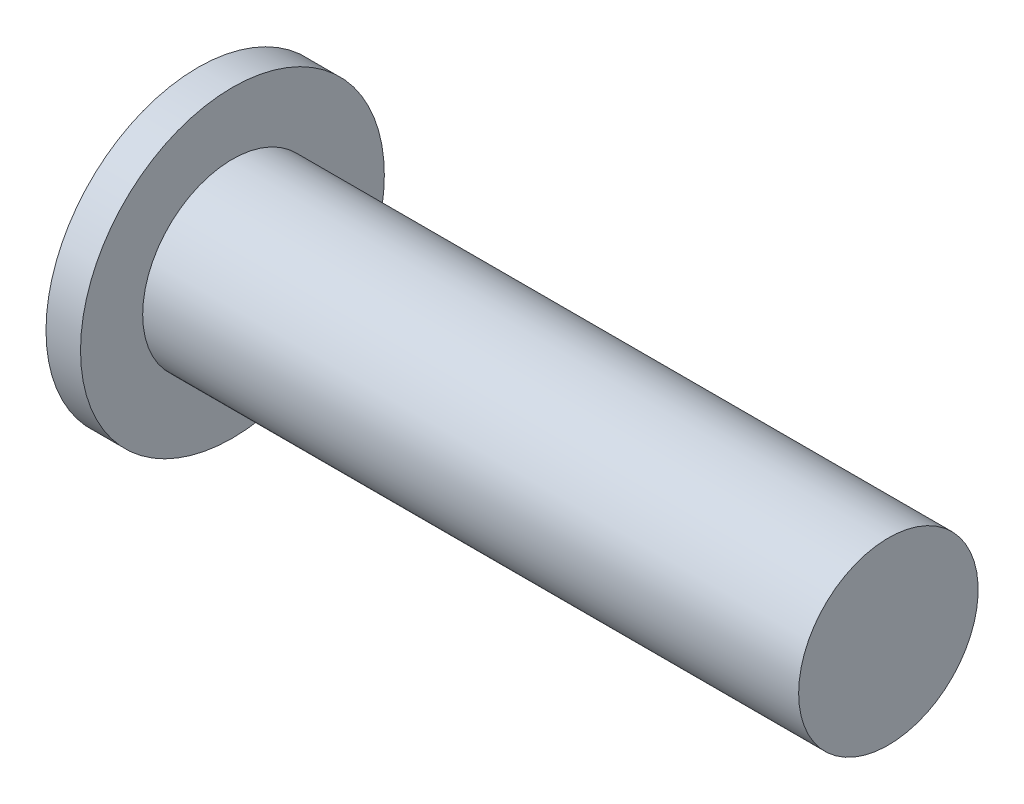
ISO-10303-21;
HEADER;
FILE_DESCRIPTION(('STEP AP214'),'2;1');
FILE_NAME('part.step','',(''),(''),'','','');
FILE_SCHEMA(('AUTOMOTIVE_DESIGN { 1 0 10303 214 1 1 1 1 }'));
ENDSEC;
DATA;
#1=APPLICATION_CONTEXT('core data for automotive mechanical design processes');
#2=APPLICATION_PROTOCOL_DEFINITION('international standard','automotive_design',2000,#1);
#3=PRODUCT_CONTEXT('',#1,'mechanical');
#4=PRODUCT('Part','Part','',(#3));
#5=PRODUCT_RELATED_PRODUCT_CATEGORY('part','',(#4));
#6=PRODUCT_DEFINITION_FORMATION('','',#4);
#7=PRODUCT_DEFINITION_CONTEXT('part definition',#1,'design');
#8=PRODUCT_DEFINITION('design','',#6,#7);
#9=PRODUCT_DEFINITION_SHAPE('','',#8);
#10=(LENGTH_UNIT() NAMED_UNIT(*) SI_UNIT(.MILLI.,.METRE.));
#11=(NAMED_UNIT(*) PLANE_ANGLE_UNIT() SI_UNIT($,.RADIAN.));
#12=(NAMED_UNIT(*) SI_UNIT($,.STERADIAN.) SOLID_ANGLE_UNIT());
#13=UNCERTAINTY_MEASURE_WITH_UNIT(LENGTH_MEASURE(1.E-05),#10,'distance_accuracy_value','');
#14=(GEOMETRIC_REPRESENTATION_CONTEXT(3) GLOBAL_UNCERTAINTY_ASSIGNED_CONTEXT((#13)) GLOBAL_UNIT_ASSIGNED_CONTEXT((#10,
#11,#12)) REPRESENTATION_CONTEXT('',''));
#15=CARTESIAN_POINT('',(0.,0.,0.));
#16=DIRECTION('',(0.,0.,1.));
#17=DIRECTION('',(1.,0.,0.));
#18=AXIS2_PLACEMENT_3D('',#15,#16,#17);
#19=CARTESIAN_POINT('',(90.,0.,0.));
#20=DIRECTION('',(-1.,0.,0.));
#21=DIRECTION('',(0.,0.,1.));
#22=AXIS2_PLACEMENT_3D('',#19,#20,#21);
#23=CYLINDRICAL_SURFACE('',#22,11.);
#24=CARTESIAN_POINT('',(90.,0.,0.));
#25=DIRECTION('',(1.,0.,0.));
#26=DIRECTION('',(0.,0.,-1.));
#27=AXIS2_PLACEMENT_3D('',#24,#25,#26);
#28=CIRCLE('',#27,11.);
#29=CARTESIAN_POINT('',(90.,0.,11.));
#30=VERTEX_POINT('',#29);
#31=EDGE_CURVE('E10',#30,#30,#28,.T.);
#32=CARTESIAN_POINT('',(-5.,0.,0.));
#33=DIRECTION('',(-1.,0.,0.));
#34=DIRECTION('',(0.,0.,1.));
#35=AXIS2_PLACEMENT_3D('',#32,#33,#34);
#36=CIRCLE('',#35,11.);
#37=CARTESIAN_POINT('',(-4.99999999999999,0.,11.));
#38=VERTEX_POINT('',#37);
#39=EDGE_CURVE('E62',#38,#38,#36,.T.);
#40=CARTESIAN_POINT('',(90.,0.,11.));
#41=CARTESIAN_POINT('',(89.0104166666666,0.,11.));
#42=CARTESIAN_POINT('',(88.0208333333333,0.,11.));
#43=CARTESIAN_POINT('',(86.0416666666667,0.,11.));
#44=CARTESIAN_POINT('',(85.0520833333333,0.,11.));
#45=CARTESIAN_POINT('',(83.0729166666666,0.,11.));
#46=CARTESIAN_POINT('',(82.0833333333333,0.,11.));
#47=CARTESIAN_POINT('',(80.1041666666667,0.,11.));
#48=CARTESIAN_POINT('',(79.1145833333333,0.,11.));
#49=CARTESIAN_POINT('',(77.1354166666667,0.,11.));
#50=CARTESIAN_POINT('',(76.1458333333333,0.,11.));
#51=CARTESIAN_POINT('',(74.1666666666667,0.,11.));
#52=CARTESIAN_POINT('',(73.1770833333333,0.,11.));
#53=CARTESIAN_POINT('',(71.1979166666667,0.,11.));
#54=CARTESIAN_POINT('',(70.2083333333333,0.,11.));
#55=CARTESIAN_POINT('',(68.2291666666667,0.,11.));
#56=CARTESIAN_POINT('',(67.2395833333333,0.,11.));
#57=CARTESIAN_POINT('',(65.2604166666667,0.,11.));
#58=CARTESIAN_POINT('',(64.2708333333333,0.,11.));
#59=CARTESIAN_POINT('',(62.2916666666667,0.,11.));
#60=CARTESIAN_POINT('',(61.3020833333333,0.,11.));
#61=CARTESIAN_POINT('',(59.3229166666667,0.,11.));
#62=CARTESIAN_POINT('',(58.3333333333333,0.,11.));
#63=CARTESIAN_POINT('',(56.3541666666667,0.,11.));
#64=CARTESIAN_POINT('',(55.3645833333333,0.,11.));
#65=CARTESIAN_POINT('',(53.3854166666667,0.,11.));
#66=CARTESIAN_POINT('',(52.3958333333333,0.,11.));
#67=CARTESIAN_POINT('',(50.4166666666667,0.,11.));
#68=CARTESIAN_POINT('',(49.4270833333333,0.,11.));
#69=CARTESIAN_POINT('',(47.4479166666667,0.,11.));
#70=CARTESIAN_POINT('',(46.4583333333333,0.,11.));
#71=CARTESIAN_POINT('',(44.4791666666667,0.,11.));
#72=CARTESIAN_POINT('',(43.4895833333333,0.,11.));
#73=CARTESIAN_POINT('',(41.5104166666667,0.,11.));
#74=CARTESIAN_POINT('',(40.5208333333333,0.,11.));
#75=CARTESIAN_POINT('',(38.5416666666667,0.,11.));
#76=CARTESIAN_POINT('',(37.5520833333333,0.,11.));
#77=CARTESIAN_POINT('',(35.5729166666667,0.,11.));
#78=CARTESIAN_POINT('',(34.5833333333333,0.,11.));
#79=CARTESIAN_POINT('',(32.6041666666667,0.,11.));
#80=CARTESIAN_POINT('',(31.6145833333333,0.,11.));
#81=CARTESIAN_POINT('',(29.6354166666667,0.,11.));
#82=CARTESIAN_POINT('',(28.6458333333333,0.,11.));
#83=CARTESIAN_POINT('',(26.6666666666667,0.,11.));
#84=CARTESIAN_POINT('',(25.6770833333333,0.,11.));
#85=CARTESIAN_POINT('',(23.6979166666667,0.,11.));
#86=CARTESIAN_POINT('',(22.7083333333333,0.,11.));
#87=CARTESIAN_POINT('',(20.7291666666667,0.,11.));
#88=CARTESIAN_POINT('',(19.7395833333333,0.,11.));
#89=CARTESIAN_POINT('',(17.7604166666667,0.,11.));
#90=CARTESIAN_POINT('',(16.7708333333333,0.,11.));
#91=CARTESIAN_POINT('',(14.7916666666667,0.,11.));
#92=CARTESIAN_POINT('',(13.8020833333333,0.,11.));
#93=CARTESIAN_POINT('',(11.8229166666667,0.,11.));
#94=CARTESIAN_POINT('',(10.8333333333333,0.,11.));
#95=CARTESIAN_POINT('',(8.85416666666668,0.,11.));
#96=CARTESIAN_POINT('',(7.86458333333334,0.,11.));
#97=CARTESIAN_POINT('',(5.88541666666667,0.,11.));
#98=CARTESIAN_POINT('',(4.89583333333334,0.,11.));
#99=CARTESIAN_POINT('',(2.91666666666668,0.,11.));
#100=CARTESIAN_POINT('',(1.92708333333334,0.,11.));
#101=CARTESIAN_POINT('',(-0.0520833333333228,0.,11.));
#102=CARTESIAN_POINT('',(-1.04166666666665,0.,11.));
#103=CARTESIAN_POINT('',(-3.02083333333332,0.,11.));
#104=CARTESIAN_POINT('',(-4.01041666666666,0.,11.));
#105=CARTESIAN_POINT('',(-4.99999999999999,0.,11.));
#106=B_SPLINE_CURVE_WITH_KNOTS('',3,(#40,#41,#42,#43,#44,#45,#46,#47,#48,#49,#50,#51,#52,#53,
#54,#55,#56,#57,#58,#59,#60,#61,#62,#63,#64,#65,#66,#67,#68,#69,#70,#71,#72,#73,#74,#75,#76,#77,
#78,#79,#80,#81,#82,#83,#84,#85,#86,#87,#88,#89,#90,#91,#92,#93,#94,#95,#96,#97,#98,#99,#100,
#101,#102,#103,#104,#105),.UNSPECIFIED.,.F.,.F.,(4,2,2,2,2,2,2,2,2,2,2,2,2,2,2,2,2,2,2,2,2,2,2,
2,2,2,2,2,2,2,2,2,4),(0.,2.96874999999999,5.9375,8.90624999999999,11.875,14.84375,17.8125,
20.78125,23.75,26.71875,29.6875,32.65625,35.625,38.59375,41.5625,44.53125,47.5,50.46875,53.4375,
56.40625,59.375,62.34375,65.3125,68.28125,71.25,74.21875,77.1875,80.15625,83.125,86.09375,
89.0625,92.03125,95.),.UNSPECIFIED.);
#107=EDGE_CURVE('BSEAM41',#30,#38,#106,.T.);
#108=ORIENTED_EDGE('',*,*,#31,.T.);
#109=ORIENTED_EDGE('',*,*,#39,.T.);
#110=ORIENTED_EDGE('',*,*,#107,.T.);
#111=ORIENTED_EDGE('',*,*,#107,.F.);
#112=EDGE_LOOP('',(#108,#110,#109,#111));
#113=FACE_BOUND('',#112,.T.);
#114=ADVANCED_FACE('F41',(#113),#23,.F.);
#115=CARTESIAN_POINT('',(90.,0.,0.));
#116=DIRECTION('',(1.,0.,0.));
#117=DIRECTION('',(0.,0.,-1.));
#118=AXIS2_PLACEMENT_3D('',#115,#116,#117);
#119=PLANE('',#118);
#120=ORIENTED_EDGE('',*,*,#31,.F.);
#121=EDGE_LOOP('',(#120));
#122=FACE_BOUND('',#121,.T.);
#123=ADVANCED_FACE('F74',(#122),#119,.F.);
#124=CARTESIAN_POINT('',(-5.,0.,0.));
#125=DIRECTION('',(-1.,0.,0.));
#126=DIRECTION('',(0.,0.,1.));
#127=AXIS2_PLACEMENT_3D('',#124,#125,#126);
#128=PLANE('',#127);
#129=CARTESIAN_POINT('',(-5.,0.,0.));
#130=DIRECTION('',(-1.,0.,0.));
#131=DIRECTION('',(0.,0.,1.));
#132=AXIS2_PLACEMENT_3D('',#129,#130,#131);
#133=CIRCLE('',#132,22.);
#134=CARTESIAN_POINT('',(-5.,0.,22.));
#135=VERTEX_POINT('',#134);
#136=EDGE_CURVE('E61',#135,#135,#133,.T.);
#137=ORIENTED_EDGE('',*,*,#136,.T.);
#138=EDGE_LOOP('',(#137));
#139=FACE_BOUND('',#138,.T.);
#140=ORIENTED_EDGE('',*,*,#39,.F.);
#141=EDGE_LOOP('',(#140));
#142=FACE_BOUND('',#141,.T.);
#143=ADVANCED_FACE('F71',(#139,#142),#128,.T.);
#144=CARTESIAN_POINT('',(0.,0.,0.));
#145=DIRECTION('',(-1.,0.,0.));
#146=DIRECTION('',(0.,0.,1.));
#147=AXIS2_PLACEMENT_3D('',#144,#145,#146);
#148=PLANE('',#147);
#149=CARTESIAN_POINT('',(0.,0.,0.));
#150=DIRECTION('',(1.,0.,0.));
#151=DIRECTION('',(0.,0.,-1.));
#152=AXIS2_PLACEMENT_3D('',#149,#150,#151);
#153=CIRCLE('',#152,13.);
#154=CARTESIAN_POINT('',(0.,0.,13.));
#155=VERTEX_POINT('',#154);
#156=EDGE_CURVE('E45',#155,#155,#153,.T.);
#157=ORIENTED_EDGE('',*,*,#156,.F.);
#158=EDGE_LOOP('',(#157));
#159=FACE_BOUND('',#158,.T.);
#160=CARTESIAN_POINT('',(0.,0.,0.));
#161=DIRECTION('',(-1.,0.,0.));
#162=DIRECTION('',(0.,0.,1.));
#163=AXIS2_PLACEMENT_3D('',#160,#161,#162);
#164=CIRCLE('',#163,22.);
#165=CARTESIAN_POINT('',(0.,0.,22.));
#166=VERTEX_POINT('',#165);
#167=EDGE_CURVE('E57',#166,#166,#164,.T.);
#168=ORIENTED_EDGE('',*,*,#167,.F.);
#169=EDGE_LOOP('',(#168));
#170=FACE_BOUND('',#169,.T.);
#171=ADVANCED_FACE('F73',(#159,#170),#148,.F.);
#172=CARTESIAN_POINT('',(-5.,0.,0.));
#173=DIRECTION('',(1.,0.,0.));
#174=DIRECTION('',(0.,0.,-1.));
#175=AXIS2_PLACEMENT_3D('',#172,#173,#174);
#176=CYLINDRICAL_SURFACE('',#175,22.);
#177=ORIENTED_EDGE('',*,*,#136,.F.);
#178=EDGE_LOOP('',(#177));
#179=FACE_BOUND('',#178,.T.);
#180=ORIENTED_EDGE('',*,*,#167,.T.);
#181=EDGE_LOOP('',(#180));
#182=FACE_BOUND('',#181,.T.);
#183=ADVANCED_FACE('F81',(#179,#182),#176,.T.);
#184=CARTESIAN_POINT('',(95.,0.,0.));
#185=DIRECTION('',(1.,0.,0.));
#186=DIRECTION('',(0.,0.,-1.));
#187=AXIS2_PLACEMENT_3D('',#184,#185,#186);
#188=PLANE('',#187);
#189=CARTESIAN_POINT('',(95.,0.,0.));
#190=DIRECTION('',(1.,0.,0.));
#191=DIRECTION('',(0.,0.,-1.));
#192=AXIS2_PLACEMENT_3D('',#189,#190,#191);
#193=CIRCLE('',#192,13.);
#194=CARTESIAN_POINT('',(95.,0.,13.));
#195=VERTEX_POINT('',#194);
#196=EDGE_CURVE('E50',#195,#195,#193,.T.);
#197=ORIENTED_EDGE('',*,*,#196,.T.);
#198=EDGE_LOOP('',(#197));
#199=FACE_BOUND('',#198,.T.);
#200=ADVANCED_FACE('F90',(#199),#188,.T.);
#201=CARTESIAN_POINT('',(90.,0.,0.));
#202=DIRECTION('',(-1.,0.,0.));
#203=DIRECTION('',(0.,0.,1.));
#204=AXIS2_PLACEMENT_3D('',#201,#202,#203);
#205=CYLINDRICAL_SURFACE('',#204,13.);
#206=CARTESIAN_POINT('',(0.,0.,13.));
#207=CARTESIAN_POINT('',(0.98958333333332,0.,13.));
#208=CARTESIAN_POINT('',(1.97916666666666,0.,13.));
#209=CARTESIAN_POINT('',(3.95833333333332,0.,13.));
#210=CARTESIAN_POINT('',(4.94791666666665,0.,13.));
#211=CARTESIAN_POINT('',(6.92708333333332,0.,13.));
#212=CARTESIAN_POINT('',(7.91666666666666,0.,13.));
#213=CARTESIAN_POINT('',(9.89583333333332,0.,13.));
#214=CARTESIAN_POINT('',(10.8854166666667,0.,13.));
#215=CARTESIAN_POINT('',(12.8645833333333,0.,13.));
#216=CARTESIAN_POINT('',(13.8541666666667,0.,13.));
#217=CARTESIAN_POINT('',(15.8333333333333,0.,13.));
#218=CARTESIAN_POINT('',(16.8229166666667,0.,13.));
#219=CARTESIAN_POINT('',(18.8020833333333,0.,13.));
#220=CARTESIAN_POINT('',(19.7916666666667,0.,13.));
#221=CARTESIAN_POINT('',(21.7708333333333,0.,13.));
#222=CARTESIAN_POINT('',(22.7604166666667,0.,13.));
#223=CARTESIAN_POINT('',(24.7395833333333,0.,13.));
#224=CARTESIAN_POINT('',(25.7291666666667,0.,13.));
#225=CARTESIAN_POINT('',(27.7083333333333,0.,13.));
#226=CARTESIAN_POINT('',(28.6979166666667,0.,13.));
#227=CARTESIAN_POINT('',(30.6770833333333,0.,13.));
#228=CARTESIAN_POINT('',(31.6666666666667,0.,13.));
#229=CARTESIAN_POINT('',(33.6458333333333,0.,13.));
#230=CARTESIAN_POINT('',(34.6354166666667,0.,13.));
#231=CARTESIAN_POINT('',(36.6145833333333,0.,13.));
#232=CARTESIAN_POINT('',(37.6041666666667,0.,13.));
#233=CARTESIAN_POINT('',(39.5833333333333,0.,13.));
#234=CARTESIAN_POINT('',(40.5729166666667,0.,13.));
#235=CARTESIAN_POINT('',(42.5520833333333,0.,13.));
#236=CARTESIAN_POINT('',(43.5416666666667,0.,13.));
#237=CARTESIAN_POINT('',(45.5208333333333,0.,13.));
#238=CARTESIAN_POINT('',(46.5104166666667,0.,13.));
#239=CARTESIAN_POINT('',(48.4895833333333,0.,13.));
#240=CARTESIAN_POINT('',(49.4791666666667,0.,13.));
#241=CARTESIAN_POINT('',(51.4583333333333,0.,13.));
#242=CARTESIAN_POINT('',(52.4479166666667,0.,13.));
#243=CARTESIAN_POINT('',(54.4270833333333,0.,13.));
#244=CARTESIAN_POINT('',(55.4166666666667,0.,13.));
#245=CARTESIAN_POINT('',(57.3958333333333,0.,13.));
#246=CARTESIAN_POINT('',(58.3854166666667,0.,13.));
#247=CARTESIAN_POINT('',(60.3645833333333,0.,13.));
#248=CARTESIAN_POINT('',(61.3541666666667,0.,13.));
#249=CARTESIAN_POINT('',(63.3333333333333,0.,13.));
#250=CARTESIAN_POINT('',(64.3229166666667,0.,13.));
#251=CARTESIAN_POINT('',(66.3020833333333,0.,13.));
#252=CARTESIAN_POINT('',(67.2916666666667,0.,13.));
#253=CARTESIAN_POINT('',(69.2708333333333,0.,13.));
#254=CARTESIAN_POINT('',(70.2604166666667,0.,13.));
#255=CARTESIAN_POINT('',(72.2395833333333,0.,13.));
#256=CARTESIAN_POINT('',(73.2291666666667,0.,13.));
#257=CARTESIAN_POINT('',(75.2083333333333,0.,13.));
#258=CARTESIAN_POINT('',(76.1979166666667,0.,13.));
#259=CARTESIAN_POINT('',(78.1770833333333,0.,13.));
#260=CARTESIAN_POINT('',(79.1666666666667,0.,13.));
#261=CARTESIAN_POINT('',(81.1458333333333,0.,13.));
#262=CARTESIAN_POINT('',(82.1354166666667,0.,13.));
#263=CARTESIAN_POINT('',(84.1145833333333,0.,13.));
#264=CARTESIAN_POINT('',(85.1041666666667,0.,13.));
#265=CARTESIAN_POINT('',(87.0833333333333,0.,13.));
#266=CARTESIAN_POINT('',(88.0729166666667,0.,13.));
#267=CARTESIAN_POINT('',(90.0520833333333,0.,13.));
#268=CARTESIAN_POINT('',(91.0416666666667,0.,13.));
#269=CARTESIAN_POINT('',(93.0208333333333,0.,13.));
#270=CARTESIAN_POINT('',(94.0104166666667,0.,13.));
#271=CARTESIAN_POINT('',(95.,0.,13.));
#272=B_SPLINE_CURVE_WITH_KNOTS('',3,(#206,#207,#208,#209,#210,#211,#212,#213,#214,#215,#216,
#217,#218,#219,#220,#221,#222,#223,#224,#225,#226,#227,#228,#229,#230,#231,#232,#233,#234,#235,
#236,#237,#238,#239,#240,#241,#242,#243,#244,#245,#246,#247,#248,#249,#250,#251,#252,#253,#254,
#255,#256,#257,#258,#259,#260,#261,#262,#263,#264,#265,#266,#267,#268,#269,#270,#271),
.UNSPECIFIED.,.F.,.F.,(4,2,2,2,2,2,2,2,2,2,2,2,2,2,2,2,2,2,2,2,2,2,2,2,2,2,2,2,2,2,2,2,4),(0.,
2.96875000000001,5.9375,8.90625,11.875,14.84375,17.8125,20.78125,23.75,26.71875,29.6875,
32.65625,35.625,38.59375,41.5625,44.53125,47.5,50.46875,53.4375,56.40625,59.375,62.34375,
65.3125,68.28125,71.25,74.21875,77.1875,80.15625,83.125,86.09375,89.0625,92.03125,95.),.UNSPECIFIED.);
#273=EDGE_CURVE('BSEAM43',#155,#195,#272,.T.);
#274=ORIENTED_EDGE('',*,*,#156,.T.);
#275=ORIENTED_EDGE('',*,*,#196,.F.);
#276=ORIENTED_EDGE('',*,*,#273,.T.);
#277=ORIENTED_EDGE('',*,*,#273,.F.);
#278=EDGE_LOOP('',(#274,#276,#275,#277));
#279=FACE_BOUND('',#278,.T.);
#280=ADVANCED_FACE('F43',(#279),#205,.T.);
#281=CLOSED_SHELL('',(#114,#123,#143,#171,#183,#200,#280));
#282=MANIFOLD_SOLID_BREP('B2',#281);
#283=ADVANCED_BREP_SHAPE_REPRESENTATION('',(#18,#282),#14);
#284=SHAPE_DEFINITION_REPRESENTATION(#9,#283);
ENDSEC;
END-ISO-10303-21;
